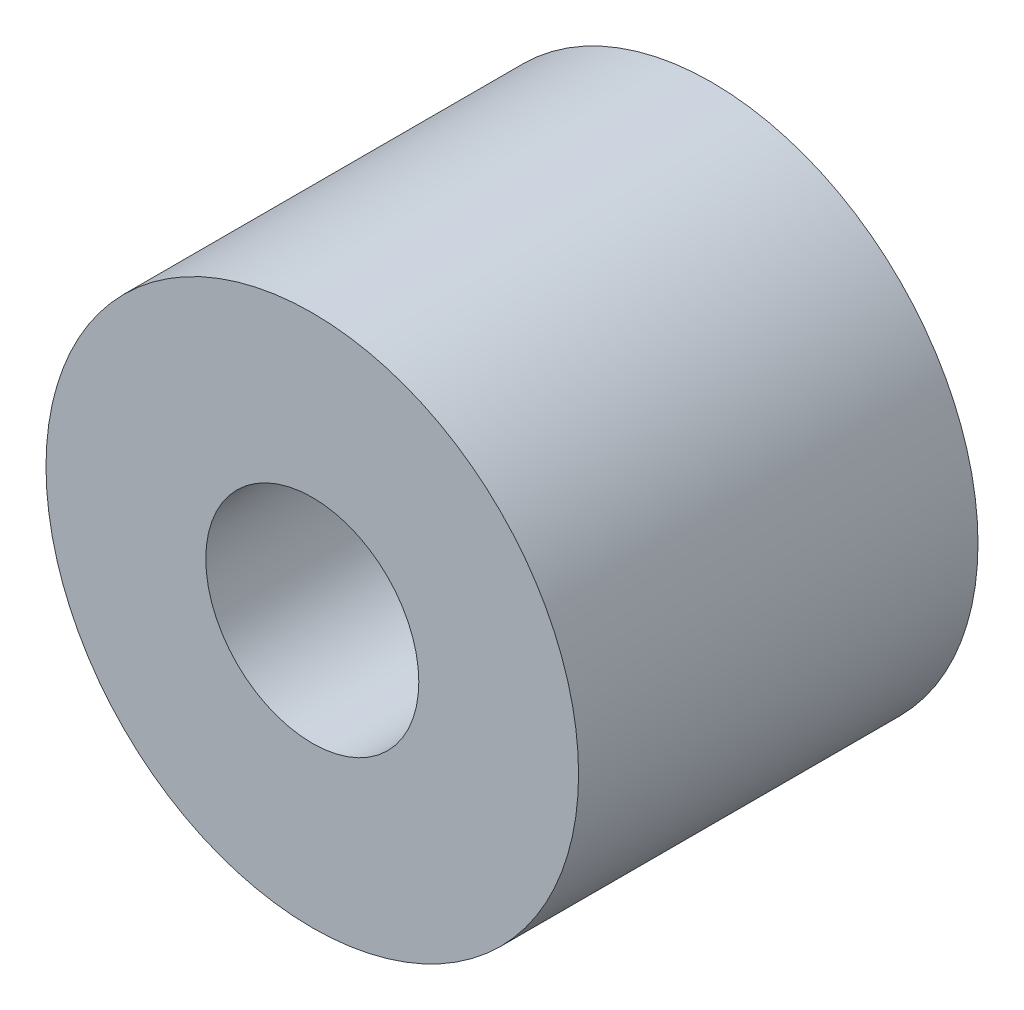
ISO-10303-21;
HEADER;
FILE_DESCRIPTION(('STEP AP214'),'2;1');
FILE_NAME('part.step','',(''),(''),'','','');
FILE_SCHEMA(('AUTOMOTIVE_DESIGN { 1 0 10303 214 1 1 1 1 }'));
ENDSEC;
DATA;
#1=APPLICATION_CONTEXT('core data for automotive mechanical design processes');
#2=APPLICATION_PROTOCOL_DEFINITION('international standard','automotive_design',2000,#1);
#3=PRODUCT_CONTEXT('',#1,'mechanical');
#4=PRODUCT('Part','Part','',(#3));
#5=PRODUCT_RELATED_PRODUCT_CATEGORY('part','',(#4));
#6=PRODUCT_DEFINITION_FORMATION('','',#4);
#7=PRODUCT_DEFINITION_CONTEXT('part definition',#1,'design');
#8=PRODUCT_DEFINITION('design','',#6,#7);
#9=PRODUCT_DEFINITION_SHAPE('','',#8);
#10=(LENGTH_UNIT() NAMED_UNIT(*) SI_UNIT(.MILLI.,.METRE.));
#11=(NAMED_UNIT(*) PLANE_ANGLE_UNIT() SI_UNIT($,.RADIAN.));
#12=(NAMED_UNIT(*) SI_UNIT($,.STERADIAN.) SOLID_ANGLE_UNIT());
#13=UNCERTAINTY_MEASURE_WITH_UNIT(LENGTH_MEASURE(1.E-05),#10,'distance_accuracy_value','');
#14=(GEOMETRIC_REPRESENTATION_CONTEXT(3) GLOBAL_UNCERTAINTY_ASSIGNED_CONTEXT((#13)) GLOBAL_UNIT_ASSIGNED_CONTEXT((#10,
#11,#12)) REPRESENTATION_CONTEXT('',''));
#15=CARTESIAN_POINT('',(0.,0.,0.));
#16=DIRECTION('',(0.,0.,1.));
#17=DIRECTION('',(1.,0.,0.));
#18=AXIS2_PLACEMENT_3D('',#15,#16,#17);
#19=CARTESIAN_POINT('',(0.,0.,3.));
#20=DIRECTION('',(0.,0.,1.));
#21=DIRECTION('',(1.,0.,0.));
#22=AXIS2_PLACEMENT_3D('',#19,#20,#21);
#23=PLANE('',#22);
#24=CARTESIAN_POINT('',(0.,0.,3.));
#25=DIRECTION('',(0.,0.,1.));
#26=DIRECTION('',(1.,0.,0.));
#27=AXIS2_PLACEMENT_3D('',#24,#25,#26);
#28=CIRCLE('',#27,4.);
#29=CARTESIAN_POINT('',(4.,0.,3.));
#30=VERTEX_POINT('',#29);
#31=EDGE_CURVE('E10',#30,#30,#28,.T.);
#32=ORIENTED_EDGE('',*,*,#31,.T.);
#33=EDGE_LOOP('',(#32));
#34=FACE_BOUND('',#33,.T.);
#35=CARTESIAN_POINT('',(0.,0.,3.));
#36=DIRECTION('',(0.,0.,1.));
#37=DIRECTION('',(1.,0.,0.));
#38=AXIS2_PLACEMENT_3D('',#35,#36,#37);
#39=CIRCLE('',#38,1.6);
#40=CARTESIAN_POINT('',(1.6,0.,3.));
#41=VERTEX_POINT('',#40);
#42=EDGE_CURVE('E48',#41,#41,#39,.T.);
#43=ORIENTED_EDGE('',*,*,#42,.F.);
#44=EDGE_LOOP('',(#43));
#45=FACE_BOUND('',#44,.T.);
#46=ADVANCED_FACE('F40',(#34,#45),#23,.T.);
#47=CARTESIAN_POINT('',(0.,0.,-3.));
#48=DIRECTION('',(0.,0.,1.));
#49=DIRECTION('',(1.,0.,0.));
#50=AXIS2_PLACEMENT_3D('',#47,#48,#49);
#51=PLANE('',#50);
#52=CARTESIAN_POINT('',(0.,0.,-3.));
#53=DIRECTION('',(0.,0.,1.));
#54=DIRECTION('',(1.,0.,0.));
#55=AXIS2_PLACEMENT_3D('',#52,#53,#54);
#56=CIRCLE('',#55,4.);
#57=CARTESIAN_POINT('',(4.,0.,-3.));
#58=VERTEX_POINT('',#57);
#59=EDGE_CURVE('E41',#58,#58,#56,.T.);
#60=ORIENTED_EDGE('',*,*,#59,.F.);
#61=EDGE_LOOP('',(#60));
#62=FACE_BOUND('',#61,.T.);
#63=CARTESIAN_POINT('',(0.,0.,-3.));
#64=DIRECTION('',(0.,0.,1.));
#65=DIRECTION('',(1.,0.,0.));
#66=AXIS2_PLACEMENT_3D('',#63,#64,#65);
#67=CIRCLE('',#66,1.6);
#68=CARTESIAN_POINT('',(1.6,0.,-3.));
#69=VERTEX_POINT('',#68);
#70=EDGE_CURVE('E49',#69,#69,#67,.T.);
#71=ORIENTED_EDGE('',*,*,#70,.T.);
#72=EDGE_LOOP('',(#71));
#73=FACE_BOUND('',#72,.T.);
#74=ADVANCED_FACE('F58',(#62,#73),#51,.F.);
#75=CARTESIAN_POINT('',(0.,0.,3.));
#76=DIRECTION('',(0.,0.,-1.));
#77=DIRECTION('',(-1.,0.,0.));
#78=AXIS2_PLACEMENT_3D('',#75,#76,#77);
#79=CYLINDRICAL_SURFACE('',#78,4.);
#80=ORIENTED_EDGE('',*,*,#31,.F.);
#81=EDGE_LOOP('',(#80));
#82=FACE_BOUND('',#81,.T.);
#83=ORIENTED_EDGE('',*,*,#59,.T.);
#84=EDGE_LOOP('',(#83));
#85=FACE_BOUND('',#84,.T.);
#86=ADVANCED_FACE('F39',(#82,#85),#79,.T.);
#87=CARTESIAN_POINT('',(0.,0.,3.));
#88=DIRECTION('',(0.,0.,-1.));
#89=DIRECTION('',(-1.,0.,0.));
#90=AXIS2_PLACEMENT_3D('',#87,#88,#89);
#91=CYLINDRICAL_SURFACE('',#90,1.6);
#92=ORIENTED_EDGE('',*,*,#42,.T.);
#93=EDGE_LOOP('',(#92));
#94=FACE_BOUND('',#93,.T.);
#95=ORIENTED_EDGE('',*,*,#70,.F.);
#96=EDGE_LOOP('',(#95));
#97=FACE_BOUND('',#96,.T.);
#98=ADVANCED_FACE('F57',(#94,#97),#91,.F.);
#99=CLOSED_SHELL('',(#46,#74,#86,#98));
#100=MANIFOLD_SOLID_BREP('B2',#99);
#101=ADVANCED_BREP_SHAPE_REPRESENTATION('',(#18,#100),#14);
#102=SHAPE_DEFINITION_REPRESENTATION(#9,#101);
ENDSEC;
END-ISO-10303-21;
